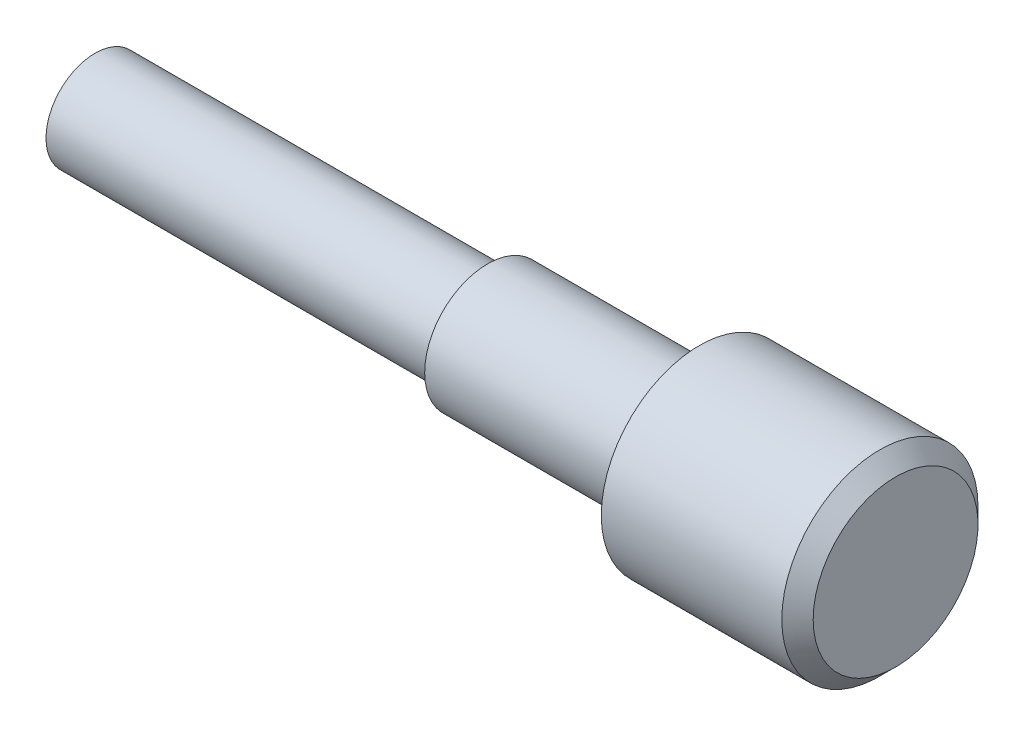
ISO-10303-21;
HEADER;
FILE_DESCRIPTION(('STEP AP214'),'2;1');
FILE_NAME('part.step','',(''),(''),'','','');
FILE_SCHEMA(('AUTOMOTIVE_DESIGN { 1 0 10303 214 1 1 1 1 }'));
ENDSEC;
DATA;
#1=APPLICATION_CONTEXT('core data for automotive mechanical design processes');
#2=APPLICATION_PROTOCOL_DEFINITION('international standard','automotive_design',2000,#1);
#3=PRODUCT_CONTEXT('',#1,'mechanical');
#4=PRODUCT('Part','Part','',(#3));
#5=PRODUCT_RELATED_PRODUCT_CATEGORY('part','',(#4));
#6=PRODUCT_DEFINITION_FORMATION('','',#4);
#7=PRODUCT_DEFINITION_CONTEXT('part definition',#1,'design');
#8=PRODUCT_DEFINITION('design','',#6,#7);
#9=PRODUCT_DEFINITION_SHAPE('','',#8);
#10=(LENGTH_UNIT() NAMED_UNIT(*) SI_UNIT(.MILLI.,.METRE.));
#11=(NAMED_UNIT(*) PLANE_ANGLE_UNIT() SI_UNIT($,.RADIAN.));
#12=(NAMED_UNIT(*) SI_UNIT($,.STERADIAN.) SOLID_ANGLE_UNIT());
#13=UNCERTAINTY_MEASURE_WITH_UNIT(LENGTH_MEASURE(1.E-05),#10,'distance_accuracy_value','');
#14=(GEOMETRIC_REPRESENTATION_CONTEXT(3) GLOBAL_UNCERTAINTY_ASSIGNED_CONTEXT((#13)) GLOBAL_UNIT_ASSIGNED_CONTEXT((#10,
#11,#12)) REPRESENTATION_CONTEXT('',''));
#15=CARTESIAN_POINT('',(0.,0.,0.));
#16=DIRECTION('',(0.,0.,1.));
#17=DIRECTION('',(1.,0.,0.));
#18=AXIS2_PLACEMENT_3D('',#15,#16,#17);
#19=CARTESIAN_POINT('',(-6.477,0.,-0.793750000000005));
#20=DIRECTION('',(1.,0.,0.));
#21=DIRECTION('',(0.,0.,-1.));
#22=AXIS2_PLACEMENT_3D('',#19,#20,#21);
#23=PLANE('',#22);
#24=CARTESIAN_POINT('',(-6.477,0.,0.));
#25=DIRECTION('',(-1.,0.,0.));
#26=DIRECTION('',(0.,0.,1.));
#27=AXIS2_PLACEMENT_3D('',#24,#25,#26);
#28=CIRCLE('',#27,0.793750000000005);
#29=CARTESIAN_POINT('',(-6.477,0.,0.793750000000005));
#30=VERTEX_POINT('',#29);
#31=EDGE_CURVE('E380',#30,#30,#28,.T.);
#32=ORIENTED_EDGE('',*,*,#31,.T.);
#33=EDGE_LOOP('',(#32));
#34=FACE_BOUND('',#33,.T.);
#35=ADVANCED_FACE('F370',(#34),#23,.F.);
#36=CARTESIAN_POINT('',(-6.477,0.,0.));
#37=DIRECTION('',(-1.,0.,0.));
#38=DIRECTION('',(0.,0.,1.));
#39=AXIS2_PLACEMENT_3D('',#36,#37,#38);
#40=CYLINDRICAL_SURFACE('',#39,0.793750000000002);
#41=ORIENTED_EDGE('',*,*,#31,.F.);
#42=EDGE_LOOP('',(#41));
#43=FACE_BOUND('',#42,.T.);
#44=CARTESIAN_POINT('',(-0.127,0.,0.));
#45=DIRECTION('',(-1.,0.,0.));
#46=DIRECTION('',(0.,0.,1.));
#47=AXIS2_PLACEMENT_3D('',#44,#45,#46);
#48=CIRCLE('',#47,0.793749999999999);
#49=CARTESIAN_POINT('',(-0.127,0.,0.793749999999995));
#50=VERTEX_POINT('',#49);
#51=EDGE_CURVE('E384',#50,#50,#48,.T.);
#52=ORIENTED_EDGE('',*,*,#51,.T.);
#53=EDGE_LOOP('',(#52));
#54=FACE_BOUND('',#53,.T.);
#55=ADVANCED_FACE('F415',(#43,#54),#40,.T.);
#56=CARTESIAN_POINT('',(-0.127000000000001,0.,-1.016));
#57=DIRECTION('',(1.,0.,0.));
#58=DIRECTION('',(0.,0.,-1.));
#59=AXIS2_PLACEMENT_3D('',#56,#57,#58);
#60=PLANE('',#59);
#61=ORIENTED_EDGE('',*,*,#51,.F.);
#62=EDGE_LOOP('',(#61));
#63=FACE_BOUND('',#62,.T.);
#64=CARTESIAN_POINT('',(-0.127,0.,0.));
#65=DIRECTION('',(-1.,0.,0.));
#66=DIRECTION('',(0.,0.,1.));
#67=AXIS2_PLACEMENT_3D('',#64,#65,#66);
#68=CIRCLE('',#67,1.016);
#69=CARTESIAN_POINT('',(-0.126999999999999,0.,1.01599999999999));
#70=VERTEX_POINT('',#69);
#71=EDGE_CURVE('E389',#70,#70,#68,.T.);
#72=ORIENTED_EDGE('',*,*,#71,.T.);
#73=EDGE_LOOP('',(#72));
#74=FACE_BOUND('',#73,.T.);
#75=ADVANCED_FACE('F420',(#63,#74),#60,.F.);
#76=CARTESIAN_POINT('',(-6.477,0.,0.));
#77=DIRECTION('',(-1.,0.,0.));
#78=DIRECTION('',(0.,0.,1.));
#79=AXIS2_PLACEMENT_3D('',#76,#77,#78);
#80=CYLINDRICAL_SURFACE('',#79,1.016);
#81=ORIENTED_EDGE('',*,*,#71,.F.);
#82=EDGE_LOOP('',(#81));
#83=FACE_BOUND('',#82,.T.);
#84=CARTESIAN_POINT('',(3.302,0.,0.));
#85=DIRECTION('',(-1.,0.,0.));
#86=DIRECTION('',(0.,0.,1.));
#87=AXIS2_PLACEMENT_3D('',#84,#85,#86);
#88=CIRCLE('',#87,1.016);
#89=CARTESIAN_POINT('',(3.302,0.,1.01599999999999));
#90=VERTEX_POINT('',#89);
#91=EDGE_CURVE('E392',#90,#90,#88,.T.);
#92=ORIENTED_EDGE('',*,*,#91,.T.);
#93=EDGE_LOOP('',(#92));
#94=FACE_BOUND('',#93,.T.);
#95=ADVANCED_FACE('F411',(#83,#94),#80,.T.);
#96=CARTESIAN_POINT('',(3.302,0.,-1.5875));
#97=DIRECTION('',(1.,0.,0.));
#98=DIRECTION('',(0.,0.,-1.));
#99=AXIS2_PLACEMENT_3D('',#96,#97,#98);
#100=PLANE('',#99);
#101=ORIENTED_EDGE('',*,*,#91,.F.);
#102=EDGE_LOOP('',(#101));
#103=FACE_BOUND('',#102,.T.);
#104=CARTESIAN_POINT('',(3.302,0.,0.));
#105=DIRECTION('',(-1.,0.,0.));
#106=DIRECTION('',(0.,0.,1.));
#107=AXIS2_PLACEMENT_3D('',#104,#105,#106);
#108=CIRCLE('',#107,1.58749999999999);
#109=CARTESIAN_POINT('',(3.302,0.,1.58749999999999));
#110=VERTEX_POINT('',#109);
#111=EDGE_CURVE('E395',#110,#110,#108,.T.);
#112=ORIENTED_EDGE('',*,*,#111,.T.);
#113=EDGE_LOOP('',(#112));
#114=FACE_BOUND('',#113,.T.);
#115=ADVANCED_FACE('F399',(#103,#114),#100,.F.);
#116=CARTESIAN_POINT('',(-6.477,0.,0.));
#117=DIRECTION('',(-1.,0.,0.));
#118=DIRECTION('',(0.,0.,1.));
#119=AXIS2_PLACEMENT_3D('',#116,#117,#118);
#120=CYLINDRICAL_SURFACE('',#119,1.58749999999999);
#121=CARTESIAN_POINT('',(6.223,0.,0.));
#122=DIRECTION('',(-1.,0.,0.));
#123=DIRECTION('',(0.,0.,1.));
#124=AXIS2_PLACEMENT_3D('',#121,#122,#123);
#125=CIRCLE('',#124,1.58749999999999);
#126=CARTESIAN_POINT('',(6.223,0.,1.58749999999999));
#127=VERTEX_POINT('',#126);
#128=EDGE_CURVE('E376',#127,#127,#125,.T.);
#129=ORIENTED_EDGE('',*,*,#128,.T.);
#130=EDGE_LOOP('',(#129));
#131=FACE_BOUND('',#130,.T.);
#132=ORIENTED_EDGE('',*,*,#111,.F.);
#133=EDGE_LOOP('',(#132));
#134=FACE_BOUND('',#133,.T.);
#135=ADVANCED_FACE('F401',(#131,#134),#120,.T.);
#136=CARTESIAN_POINT('',(6.477,0.,0.));
#137=DIRECTION('',(-1.,0.,0.));
#138=DIRECTION('',(0.,0.,1.));
#139=AXIS2_PLACEMENT_3D('',#136,#137,#138);
#140=PLANE('',#139);
#141=CARTESIAN_POINT('',(6.477,0.,0.));
#142=DIRECTION('',(-1.,0.,0.));
#143=DIRECTION('',(0.,0.,1.));
#144=AXIS2_PLACEMENT_3D('',#141,#142,#143);
#145=CIRCLE('',#144,1.33349999999999);
#146=CARTESIAN_POINT('',(6.477,0.,1.33349999999999));
#147=VERTEX_POINT('',#146);
#148=EDGE_CURVE('E10',#147,#147,#145,.F.);
#149=ORIENTED_EDGE('',*,*,#148,.T.);
#150=EDGE_LOOP('',(#149));
#151=FACE_BOUND('',#150,.T.);
#152=ADVANCED_FACE('F403',(#151),#140,.F.);
#153=CARTESIAN_POINT('',(6.223,0.,0.));
#154=DIRECTION('',(-1.,0.,0.));
#155=DIRECTION('',(0.,0.,1.));
#156=AXIS2_PLACEMENT_3D('',#153,#154,#155);
#157=CONICAL_SURFACE('',#156,1.58749999999999,0.785398163397452);
#158=ORIENTED_EDGE('',*,*,#148,.F.);
#159=EDGE_LOOP('',(#158));
#160=FACE_BOUND('',#159,.T.);
#161=ORIENTED_EDGE('',*,*,#128,.F.);
#162=EDGE_LOOP('',(#161));
#163=FACE_BOUND('',#162,.T.);
#164=ADVANCED_FACE('F409',(#160,#163),#157,.T.);
#165=CLOSED_SHELL('',(#35,#55,#75,#95,#115,#135,#152,#164));
#166=MANIFOLD_SOLID_BREP('B2',#165);
#167=ADVANCED_BREP_SHAPE_REPRESENTATION('',(#18,#166),#14);
#168=SHAPE_DEFINITION_REPRESENTATION(#9,#167);
ENDSEC;
END-ISO-10303-21;
